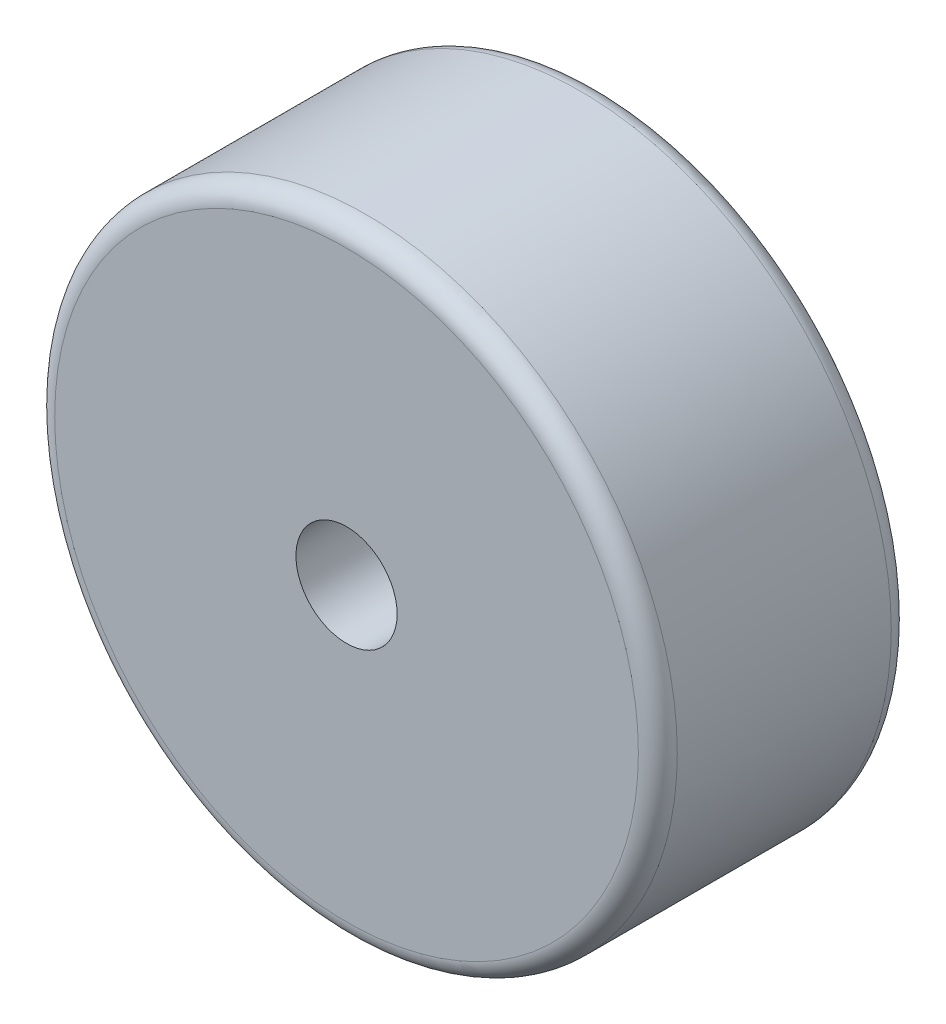
ISO-10303-21;
HEADER;
FILE_DESCRIPTION(('STEP AP214'),'2;1');
FILE_NAME('part.step','',(''),(''),'','','');
FILE_SCHEMA(('AUTOMOTIVE_DESIGN { 1 0 10303 214 1 1 1 1 }'));
ENDSEC;
DATA;
#1=APPLICATION_CONTEXT('core data for automotive mechanical design processes');
#2=APPLICATION_PROTOCOL_DEFINITION('international standard','automotive_design',2000,#1);
#3=PRODUCT_CONTEXT('',#1,'mechanical');
#4=PRODUCT('Part','Part','',(#3));
#5=PRODUCT_RELATED_PRODUCT_CATEGORY('part','',(#4));
#6=PRODUCT_DEFINITION_FORMATION('','',#4);
#7=PRODUCT_DEFINITION_CONTEXT('part definition',#1,'design');
#8=PRODUCT_DEFINITION('design','',#6,#7);
#9=PRODUCT_DEFINITION_SHAPE('','',#8);
#10=(LENGTH_UNIT() NAMED_UNIT(*) SI_UNIT(.MILLI.,.METRE.));
#11=(NAMED_UNIT(*) PLANE_ANGLE_UNIT() SI_UNIT($,.RADIAN.));
#12=(NAMED_UNIT(*) SI_UNIT($,.STERADIAN.) SOLID_ANGLE_UNIT());
#13=UNCERTAINTY_MEASURE_WITH_UNIT(LENGTH_MEASURE(1.E-05),#10,'distance_accuracy_value','');
#14=(GEOMETRIC_REPRESENTATION_CONTEXT(3) GLOBAL_UNCERTAINTY_ASSIGNED_CONTEXT((#13)) GLOBAL_UNIT_ASSIGNED_CONTEXT((#10,
#11,#12)) REPRESENTATION_CONTEXT('',''));
#15=CARTESIAN_POINT('',(0.,0.,0.));
#16=DIRECTION('',(0.,0.,1.));
#17=DIRECTION('',(1.,0.,0.));
#18=AXIS2_PLACEMENT_3D('',#15,#16,#17);
#19=CARTESIAN_POINT('',(0.,0.,13.));
#20=DIRECTION('',(0.,0.,-1.));
#21=DIRECTION('',(-1.,0.,0.));
#22=AXIS2_PLACEMENT_3D('',#19,#20,#21);
#23=CYLINDRICAL_SURFACE('',#22,16.);
#24=CARTESIAN_POINT('',(0.,0.,0.999999999999999));
#25=DIRECTION('',(0.,0.,1.));
#26=DIRECTION('',(1.,0.,0.));
#27=AXIS2_PLACEMENT_3D('',#24,#25,#26);
#28=CIRCLE('',#27,16.);
#29=CARTESIAN_POINT('',(-16.,0.,0.999999999999997));
#30=VERTEX_POINT('',#29);
#31=EDGE_CURVE('E50',#30,#30,#28,.T.);
#32=CARTESIAN_POINT('',(0.,0.,12.));
#33=DIRECTION('',(0.,0.,1.));
#34=DIRECTION('',(1.,0.,0.));
#35=AXIS2_PLACEMENT_3D('',#32,#33,#34);
#36=CIRCLE('',#35,16.);
#37=CARTESIAN_POINT('',(-16.,0.,12.));
#38=VERTEX_POINT('',#37);
#39=EDGE_CURVE('E54',#38,#38,#36,.F.);
#40=CARTESIAN_POINT('',(-16.,0.,0.999999999999997));
#41=CARTESIAN_POINT('',(-16.,0.,1.11458333333333));
#42=CARTESIAN_POINT('',(-16.,0.,1.22916666666666));
#43=CARTESIAN_POINT('',(-16.,0.,1.45833333333333));
#44=CARTESIAN_POINT('',(-16.,0.,1.57291666666666));
#45=CARTESIAN_POINT('',(-16.,0.,1.80208333333333));
#46=CARTESIAN_POINT('',(-16.,0.,1.91666666666666));
#47=CARTESIAN_POINT('',(-16.,0.,2.14583333333333));
#48=CARTESIAN_POINT('',(-16.,0.,2.26041666666667));
#49=CARTESIAN_POINT('',(-16.,0.,2.48958333333333));
#50=CARTESIAN_POINT('',(-16.,0.,2.60416666666666));
#51=CARTESIAN_POINT('',(-16.,0.,2.83333333333333));
#52=CARTESIAN_POINT('',(-16.,0.,2.94791666666666));
#53=CARTESIAN_POINT('',(-16.,0.,3.17708333333333));
#54=CARTESIAN_POINT('',(-16.,0.,3.29166666666666));
#55=CARTESIAN_POINT('',(-16.,0.,3.52083333333333));
#56=CARTESIAN_POINT('',(-16.,0.,3.63541666666666));
#57=CARTESIAN_POINT('',(-16.,0.,3.86458333333333));
#58=CARTESIAN_POINT('',(-16.,0.,3.97916666666666));
#59=CARTESIAN_POINT('',(-16.,0.,4.20833333333333));
#60=CARTESIAN_POINT('',(-16.,0.,4.32291666666667));
#61=CARTESIAN_POINT('',(-16.,0.,4.55208333333333));
#62=CARTESIAN_POINT('',(-16.,0.,4.66666666666666));
#63=CARTESIAN_POINT('',(-16.,0.,4.89583333333333));
#64=CARTESIAN_POINT('',(-16.,0.,5.01041666666666));
#65=CARTESIAN_POINT('',(-16.,0.,5.23958333333333));
#66=CARTESIAN_POINT('',(-16.,0.,5.35416666666666));
#67=CARTESIAN_POINT('',(-16.,0.,5.58333333333333));
#68=CARTESIAN_POINT('',(-16.,0.,5.69791666666666));
#69=CARTESIAN_POINT('',(-16.,0.,5.92708333333333));
#70=CARTESIAN_POINT('',(-16.,0.,6.04166666666666));
#71=CARTESIAN_POINT('',(-16.,0.,6.27083333333333));
#72=CARTESIAN_POINT('',(-16.,0.,6.38541666666666));
#73=CARTESIAN_POINT('',(-16.,0.,6.61458333333333));
#74=CARTESIAN_POINT('',(-16.,0.,6.72916666666666));
#75=CARTESIAN_POINT('',(-16.,0.,6.95833333333333));
#76=CARTESIAN_POINT('',(-16.,0.,7.07291666666667));
#77=CARTESIAN_POINT('',(-16.,0.,7.30208333333333));
#78=CARTESIAN_POINT('',(-16.,0.,7.41666666666667));
#79=CARTESIAN_POINT('',(-16.,0.,7.64583333333333));
#80=CARTESIAN_POINT('',(-16.,0.,7.76041666666666));
#81=CARTESIAN_POINT('',(-16.,0.,7.98958333333333));
#82=CARTESIAN_POINT('',(-16.,0.,8.10416666666667));
#83=CARTESIAN_POINT('',(-16.,0.,8.33333333333333));
#84=CARTESIAN_POINT('',(-16.,0.,8.44791666666666));
#85=CARTESIAN_POINT('',(-16.,0.,8.67708333333333));
#86=CARTESIAN_POINT('',(-16.,0.,8.79166666666666));
#87=CARTESIAN_POINT('',(-16.,0.,9.02083333333333));
#88=CARTESIAN_POINT('',(-16.,0.,9.13541666666666));
#89=CARTESIAN_POINT('',(-16.,0.,9.36458333333333));
#90=CARTESIAN_POINT('',(-16.,0.,9.47916666666667));
#91=CARTESIAN_POINT('',(-16.,0.,9.70833333333333));
#92=CARTESIAN_POINT('',(-16.,0.,9.82291666666667));
#93=CARTESIAN_POINT('',(-16.,0.,10.0520833333333));
#94=CARTESIAN_POINT('',(-16.,0.,10.1666666666667));
#95=CARTESIAN_POINT('',(-16.,0.,10.3958333333333));
#96=CARTESIAN_POINT('',(-16.,0.,10.5104166666667));
#97=CARTESIAN_POINT('',(-16.,0.,10.7395833333333));
#98=CARTESIAN_POINT('',(-16.,0.,10.8541666666667));
#99=CARTESIAN_POINT('',(-16.,0.,11.0833333333333));
#100=CARTESIAN_POINT('',(-16.,0.,11.1979166666667));
#101=CARTESIAN_POINT('',(-16.,0.,11.4270833333333));
#102=CARTESIAN_POINT('',(-16.,0.,11.5416666666667));
#103=CARTESIAN_POINT('',(-16.,0.,11.7708333333333));
#104=CARTESIAN_POINT('',(-16.,0.,11.8854166666667));
#105=CARTESIAN_POINT('',(-16.,0.,12.));
#106=B_SPLINE_CURVE_WITH_KNOTS('',3,(#40,#41,#42,#43,#44,#45,#46,#47,#48,#49,#50,#51,#52,#53,
#54,#55,#56,#57,#58,#59,#60,#61,#62,#63,#64,#65,#66,#67,#68,#69,#70,#71,#72,#73,#74,#75,#76,#77,
#78,#79,#80,#81,#82,#83,#84,#85,#86,#87,#88,#89,#90,#91,#92,#93,#94,#95,#96,#97,#98,#99,#100,
#101,#102,#103,#104,#105),.UNSPECIFIED.,.F.,.F.,(4,2,2,2,2,2,2,2,2,2,2,2,2,2,2,2,2,2,2,2,2,2,2,
2,2,2,2,2,2,2,2,2,4),(0.,0.34375,0.687500000000001,1.03125,1.375,1.71875,2.0625,2.40625,2.75,
3.09375,3.4375,3.78125,4.125,4.46875,4.8125,5.15625,5.5,5.84375,6.1875,6.53125,6.875,7.21875,
7.5625,7.90625,8.25,8.59375,8.9375,9.28125,9.625,9.96875,10.3125,10.65625,11.),.UNSPECIFIED.);
#107=EDGE_CURVE('BSEAM39',#30,#38,#106,.T.);
#108=ORIENTED_EDGE('',*,*,#31,.T.);
#109=ORIENTED_EDGE('',*,*,#39,.T.);
#110=ORIENTED_EDGE('',*,*,#107,.T.);
#111=ORIENTED_EDGE('',*,*,#107,.F.);
#112=EDGE_LOOP('',(#108,#110,#109,#111));
#113=FACE_BOUND('',#112,.T.);
#114=ADVANCED_FACE('F39',(#113),#23,.T.);
#115=CARTESIAN_POINT('',(0.,0.,13.));
#116=DIRECTION('',(0.,0.,1.));
#117=DIRECTION('',(1.,0.,0.));
#118=AXIS2_PLACEMENT_3D('',#115,#116,#117);
#119=PLANE('',#118);
#120=CARTESIAN_POINT('',(0.,0.,13.));
#121=DIRECTION('',(0.,0.,1.));
#122=DIRECTION('',(1.,0.,0.));
#123=AXIS2_PLACEMENT_3D('',#120,#121,#122);
#124=CIRCLE('',#123,15.);
#125=CARTESIAN_POINT('',(15.,0.,13.));
#126=VERTEX_POINT('',#125);
#127=EDGE_CURVE('E10',#126,#126,#124,.T.);
#128=ORIENTED_EDGE('',*,*,#127,.T.);
#129=EDGE_LOOP('',(#128));
#130=FACE_BOUND('',#129,.T.);
#131=CARTESIAN_POINT('',(0.,0.,13.));
#132=DIRECTION('',(0.,0.,1.));
#133=DIRECTION('',(1.,0.,0.));
#134=AXIS2_PLACEMENT_3D('',#131,#132,#133);
#135=CIRCLE('',#134,2.6);
#136=CARTESIAN_POINT('',(2.6,0.,13.));
#137=VERTEX_POINT('',#136);
#138=EDGE_CURVE('E60',#137,#137,#135,.T.);
#139=ORIENTED_EDGE('',*,*,#138,.F.);
#140=EDGE_LOOP('',(#139));
#141=FACE_BOUND('',#140,.T.);
#142=ADVANCED_FACE('F75',(#130,#141),#119,.T.);
#143=CARTESIAN_POINT('',(0.,0.,0.));
#144=DIRECTION('',(0.,0.,1.));
#145=DIRECTION('',(1.,0.,0.));
#146=AXIS2_PLACEMENT_3D('',#143,#144,#145);
#147=PLANE('',#146);
#148=CARTESIAN_POINT('',(0.,0.,0.));
#149=DIRECTION('',(0.,0.,1.));
#150=DIRECTION('',(1.,0.,0.));
#151=AXIS2_PLACEMENT_3D('',#148,#149,#150);
#152=CIRCLE('',#151,15.);
#153=CARTESIAN_POINT('',(15.,0.,0.));
#154=VERTEX_POINT('',#153);
#155=EDGE_CURVE('E46',#154,#154,#152,.F.);
#156=ORIENTED_EDGE('',*,*,#155,.T.);
#157=EDGE_LOOP('',(#156));
#158=FACE_BOUND('',#157,.T.);
#159=CARTESIAN_POINT('',(0.,0.,0.));
#160=DIRECTION('',(0.,0.,1.));
#161=DIRECTION('',(1.,0.,0.));
#162=AXIS2_PLACEMENT_3D('',#159,#160,#161);
#163=CIRCLE('',#162,2.6);
#164=CARTESIAN_POINT('',(2.6,0.,0.));
#165=VERTEX_POINT('',#164);
#166=EDGE_CURVE('E59',#165,#165,#163,.T.);
#167=ORIENTED_EDGE('',*,*,#166,.T.);
#168=EDGE_LOOP('',(#167));
#169=FACE_BOUND('',#168,.T.);
#170=ADVANCED_FACE('F66',(#158,#169),#147,.F.);
#171=CARTESIAN_POINT('',(0.,0.,0.));
#172=DIRECTION('',(0.,0.,1.));
#173=DIRECTION('',(1.,0.,0.));
#174=AXIS2_PLACEMENT_3D('',#171,#172,#173);
#175=CYLINDRICAL_SURFACE('',#174,2.6);
#176=CARTESIAN_POINT('',(2.6,0.,0.));
#177=CARTESIAN_POINT('',(2.6,0.,0.135416666666666));
#178=CARTESIAN_POINT('',(2.6,0.,0.270833333333333));
#179=CARTESIAN_POINT('',(2.6,0.,0.541666666666667));
#180=CARTESIAN_POINT('',(2.6,0.,0.677083333333333));
#181=CARTESIAN_POINT('',(2.6,0.,0.947916666666667));
#182=CARTESIAN_POINT('',(2.6,0.,1.08333333333333));
#183=CARTESIAN_POINT('',(2.6,0.,1.35416666666667));
#184=CARTESIAN_POINT('',(2.6,0.,1.48958333333333));
#185=CARTESIAN_POINT('',(2.6,0.,1.76041666666667));
#186=CARTESIAN_POINT('',(2.6,0.,1.89583333333333));
#187=CARTESIAN_POINT('',(2.6,0.,2.16666666666667));
#188=CARTESIAN_POINT('',(2.6,0.,2.30208333333333));
#189=CARTESIAN_POINT('',(2.6,0.,2.57291666666667));
#190=CARTESIAN_POINT('',(2.6,0.,2.70833333333333));
#191=CARTESIAN_POINT('',(2.6,0.,2.97916666666667));
#192=CARTESIAN_POINT('',(2.6,0.,3.11458333333333));
#193=CARTESIAN_POINT('',(2.6,0.,3.38541666666667));
#194=CARTESIAN_POINT('',(2.6,0.,3.52083333333333));
#195=CARTESIAN_POINT('',(2.6,0.,3.79166666666667));
#196=CARTESIAN_POINT('',(2.6,0.,3.92708333333333));
#197=CARTESIAN_POINT('',(2.6,0.,4.19791666666667));
#198=CARTESIAN_POINT('',(2.6,0.,4.33333333333333));
#199=CARTESIAN_POINT('',(2.6,0.,4.60416666666667));
#200=CARTESIAN_POINT('',(2.6,0.,4.73958333333333));
#201=CARTESIAN_POINT('',(2.6,0.,5.01041666666667));
#202=CARTESIAN_POINT('',(2.6,0.,5.14583333333333));
#203=CARTESIAN_POINT('',(2.6,0.,5.41666666666667));
#204=CARTESIAN_POINT('',(2.6,0.,5.55208333333333));
#205=CARTESIAN_POINT('',(2.6,0.,5.82291666666667));
#206=CARTESIAN_POINT('',(2.6,0.,5.95833333333333));
#207=CARTESIAN_POINT('',(2.6,0.,6.22916666666667));
#208=CARTESIAN_POINT('',(2.6,0.,6.36458333333333));
#209=CARTESIAN_POINT('',(2.6,0.,6.63541666666667));
#210=CARTESIAN_POINT('',(2.6,0.,6.77083333333333));
#211=CARTESIAN_POINT('',(2.6,0.,7.04166666666667));
#212=CARTESIAN_POINT('',(2.6,0.,7.17708333333333));
#213=CARTESIAN_POINT('',(2.6,0.,7.44791666666667));
#214=CARTESIAN_POINT('',(2.6,0.,7.58333333333333));
#215=CARTESIAN_POINT('',(2.6,0.,7.85416666666667));
#216=CARTESIAN_POINT('',(2.6,0.,7.98958333333333));
#217=CARTESIAN_POINT('',(2.6,0.,8.26041666666667));
#218=CARTESIAN_POINT('',(2.6,0.,8.39583333333333));
#219=CARTESIAN_POINT('',(2.6,0.,8.66666666666667));
#220=CARTESIAN_POINT('',(2.6,0.,8.80208333333333));
#221=CARTESIAN_POINT('',(2.6,0.,9.07291666666667));
#222=CARTESIAN_POINT('',(2.6,0.,9.20833333333333));
#223=CARTESIAN_POINT('',(2.6,0.,9.47916666666667));
#224=CARTESIAN_POINT('',(2.6,0.,9.61458333333333));
#225=CARTESIAN_POINT('',(2.6,0.,9.88541666666667));
#226=CARTESIAN_POINT('',(2.6,0.,10.0208333333333));
#227=CARTESIAN_POINT('',(2.6,0.,10.2916666666667));
#228=CARTESIAN_POINT('',(2.6,0.,10.4270833333333));
#229=CARTESIAN_POINT('',(2.6,0.,10.6979166666667));
#230=CARTESIAN_POINT('',(2.6,0.,10.8333333333333));
#231=CARTESIAN_POINT('',(2.6,0.,11.1041666666667));
#232=CARTESIAN_POINT('',(2.6,0.,11.2395833333333));
#233=CARTESIAN_POINT('',(2.6,0.,11.5104166666667));
#234=CARTESIAN_POINT('',(2.6,0.,11.6458333333333));
#235=CARTESIAN_POINT('',(2.6,0.,11.9166666666667));
#236=CARTESIAN_POINT('',(2.6,0.,12.0520833333333));
#237=CARTESIAN_POINT('',(2.6,0.,12.3229166666667));
#238=CARTESIAN_POINT('',(2.6,0.,12.4583333333333));
#239=CARTESIAN_POINT('',(2.6,0.,12.7291666666667));
#240=CARTESIAN_POINT('',(2.6,0.,12.8645833333333));
#241=CARTESIAN_POINT('',(2.6,0.,13.));
#242=B_SPLINE_CURVE_WITH_KNOTS('',3,(#176,#177,#178,#179,#180,#181,#182,#183,#184,#185,#186,
#187,#188,#189,#190,#191,#192,#193,#194,#195,#196,#197,#198,#199,#200,#201,#202,#203,#204,#205,
#206,#207,#208,#209,#210,#211,#212,#213,#214,#215,#216,#217,#218,#219,#220,#221,#222,#223,#224,
#225,#226,#227,#228,#229,#230,#231,#232,#233,#234,#235,#236,#237,#238,#239,#240,#241),
.UNSPECIFIED.,.F.,.F.,(4,2,2,2,2,2,2,2,2,2,2,2,2,2,2,2,2,2,2,2,2,2,2,2,2,2,2,2,2,2,2,2,4),(0.,
0.40625,0.8125,1.21875,1.625,2.03125,2.4375,2.84375,3.25,3.65625,4.0625,4.46875,4.875,5.28125,
5.6875,6.09375,6.5,6.90625,7.3125,7.71875,8.125,8.53125,8.9375,9.34375,9.75,10.15625,10.5625,
10.96875,11.375,11.78125,12.1875,12.59375,13.),.UNSPECIFIED.);
#243=EDGE_CURVE('BSEAM68',#165,#137,#242,.T.);
#244=ORIENTED_EDGE('',*,*,#166,.F.);
#245=ORIENTED_EDGE('',*,*,#138,.T.);
#246=ORIENTED_EDGE('',*,*,#243,.T.);
#247=ORIENTED_EDGE('',*,*,#243,.F.);
#248=EDGE_LOOP('',(#244,#246,#245,#247));
#249=FACE_BOUND('',#248,.T.);
#250=ADVANCED_FACE('F68',(#249),#175,.F.);
#251=CARTESIAN_POINT('',(0.,0.,0.999999999999999));
#252=DIRECTION('',(0.,0.,1.));
#253=DIRECTION('',(1.,0.,0.));
#254=AXIS2_PLACEMENT_3D('',#251,#252,#253);
#255=TOROIDAL_SURFACE('',#254,15.,1.);
#256=ORIENTED_EDGE('',*,*,#155,.F.);
#257=EDGE_LOOP('',(#256));
#258=FACE_BOUND('',#257,.T.);
#259=ORIENTED_EDGE('',*,*,#31,.F.);
#260=EDGE_LOOP('',(#259));
#261=FACE_BOUND('',#260,.T.);
#262=ADVANCED_FACE('F71',(#258,#261),#255,.T.);
#263=CARTESIAN_POINT('',(0.,0.,12.));
#264=DIRECTION('',(0.,0.,1.));
#265=DIRECTION('',(1.,0.,0.));
#266=AXIS2_PLACEMENT_3D('',#263,#264,#265);
#267=TOROIDAL_SURFACE('',#266,15.,1.);
#268=ORIENTED_EDGE('',*,*,#39,.F.);
#269=EDGE_LOOP('',(#268));
#270=FACE_BOUND('',#269,.T.);
#271=ORIENTED_EDGE('',*,*,#127,.F.);
#272=EDGE_LOOP('',(#271));
#273=FACE_BOUND('',#272,.T.);
#274=ADVANCED_FACE('F41',(#270,#273),#267,.T.);
#275=CLOSED_SHELL('',(#114,#142,#170,#250,#262,#274));
#276=MANIFOLD_SOLID_BREP('B2',#275);
#277=ADVANCED_BREP_SHAPE_REPRESENTATION('',(#18,#276),#14);
#278=SHAPE_DEFINITION_REPRESENTATION(#9,#277);
ENDSEC;
END-ISO-10303-21;
